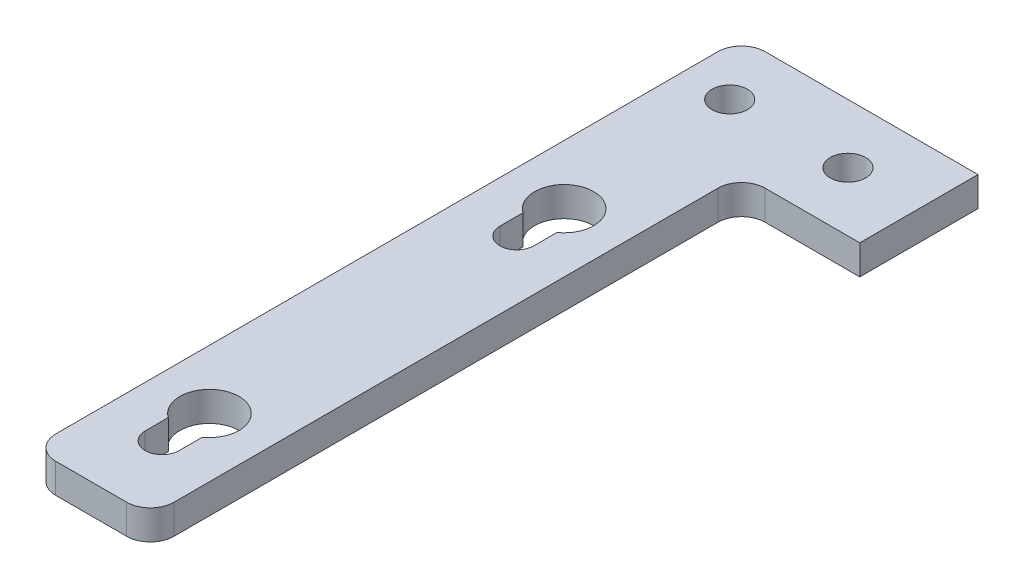
ISO-10303-21;
HEADER;
FILE_DESCRIPTION(('STEP AP214'),'2;1');
FILE_NAME('part.step','',(''),(''),'','','');
FILE_SCHEMA(('AUTOMOTIVE_DESIGN { 1 0 10303 214 1 1 1 1 }'));
ENDSEC;
DATA;
#1=APPLICATION_CONTEXT('core data for automotive mechanical design processes');
#2=APPLICATION_PROTOCOL_DEFINITION('international standard','automotive_design',2000,#1);
#3=PRODUCT_CONTEXT('',#1,'mechanical');
#4=PRODUCT('Part','Part','',(#3));
#5=PRODUCT_RELATED_PRODUCT_CATEGORY('part','',(#4));
#6=PRODUCT_DEFINITION_FORMATION('','',#4);
#7=PRODUCT_DEFINITION_CONTEXT('part definition',#1,'design');
#8=PRODUCT_DEFINITION('design','',#6,#7);
#9=PRODUCT_DEFINITION_SHAPE('','',#8);
#10=(LENGTH_UNIT() NAMED_UNIT(*) SI_UNIT(.MILLI.,.METRE.));
#11=(NAMED_UNIT(*) PLANE_ANGLE_UNIT() SI_UNIT($,.RADIAN.));
#12=(NAMED_UNIT(*) SI_UNIT($,.STERADIAN.) SOLID_ANGLE_UNIT());
#13=UNCERTAINTY_MEASURE_WITH_UNIT(LENGTH_MEASURE(1.E-05),#10,'distance_accuracy_value','');
#14=(GEOMETRIC_REPRESENTATION_CONTEXT(3) GLOBAL_UNCERTAINTY_ASSIGNED_CONTEXT((#13)) GLOBAL_UNIT_ASSIGNED_CONTEXT((#10,
#11,#12)) REPRESENTATION_CONTEXT('',''));
#15=CARTESIAN_POINT('',(0.,0.,0.));
#16=DIRECTION('',(0.,0.,1.));
#17=DIRECTION('',(1.,0.,0.));
#18=AXIS2_PLACEMENT_3D('',#15,#16,#17);
#19=CARTESIAN_POINT('',(0.,3.175,-76.2));
#20=DIRECTION('',(0.,0.,-1.));
#21=DIRECTION('',(-1.,0.,0.));
#22=AXIS2_PLACEMENT_3D('',#19,#20,#21);
#23=PLANE('',#22);
#24=DIRECTION('',(1.,0.,0.));
#25=VECTOR('',#24,1.);
#26=CARTESIAN_POINT('',(0.,0.,-76.2));
#27=LINE('',#26,#25);
#28=CARTESIAN_POINT('',(2.54,0.,-76.2));
#29=VERTEX_POINT('',#28);
#30=CARTESIAN_POINT('',(25.4,0.,-76.2));
#31=VERTEX_POINT('',#30);
#32=EDGE_CURVE('E256',#29,#31,#27,.T.);
#33=ORIENTED_EDGE('',*,*,#32,.F.);
#34=DIRECTION('',(0.,-1.,0.));
#35=VECTOR('',#34,1.);
#36=CARTESIAN_POINT('',(2.54,3.175,-76.2));
#37=LINE('',#36,#35);
#38=CARTESIAN_POINT('',(2.54,3.175,-76.2));
#39=VERTEX_POINT('',#38);
#40=EDGE_CURVE('E323',#29,#39,#37,.F.);
#41=ORIENTED_EDGE('',*,*,#40,.T.);
#42=DIRECTION('',(1.,0.,0.));
#43=VECTOR('',#42,1.);
#44=CARTESIAN_POINT('',(0.,3.175,-76.2));
#45=LINE('',#44,#43);
#46=CARTESIAN_POINT('',(25.4,3.175,-76.2));
#47=VERTEX_POINT('',#46);
#48=EDGE_CURVE('E259',#39,#47,#45,.T.);
#49=ORIENTED_EDGE('',*,*,#48,.T.);
#50=DIRECTION('',(0.,-1.,0.));
#51=VECTOR('',#50,1.);
#52=CARTESIAN_POINT('',(25.4,3.175,-76.2));
#53=LINE('',#52,#51);
#54=EDGE_CURVE('E275',#47,#31,#53,.T.);
#55=ORIENTED_EDGE('',*,*,#54,.T.);
#56=EDGE_LOOP('',(#33,#41,#49,#55));
#57=FACE_BOUND('',#56,.T.);
#58=ADVANCED_FACE('F50',(#57),#23,.T.);
#59=CARTESIAN_POINT('',(0.,3.175,0.));
#60=DIRECTION('',(-1.,0.,0.));
#61=DIRECTION('',(0.,0.,1.));
#62=AXIS2_PLACEMENT_3D('',#59,#60,#61);
#63=PLANE('',#62);
#64=DIRECTION('',(0.,0.,-1.));
#65=VECTOR('',#64,1.);
#66=CARTESIAN_POINT('',(0.,0.,0.));
#67=LINE('',#66,#65);
#68=CARTESIAN_POINT('',(0.,0.,-2.54));
#69=VERTEX_POINT('',#68);
#70=CARTESIAN_POINT('',(0.,0.,-73.66));
#71=VERTEX_POINT('',#70);
#72=EDGE_CURVE('E277',#69,#71,#67,.T.);
#73=ORIENTED_EDGE('',*,*,#72,.F.);
#74=DIRECTION('',(0.,-1.,0.));
#75=VECTOR('',#74,1.);
#76=CARTESIAN_POINT('',(0.,3.175,-2.54));
#77=LINE('',#76,#75);
#78=CARTESIAN_POINT('',(0.,3.175,-2.54));
#79=VERTEX_POINT('',#78);
#80=EDGE_CURVE('E72',#69,#79,#77,.F.);
#81=ORIENTED_EDGE('',*,*,#80,.T.);
#82=DIRECTION('',(0.,0.,-1.));
#83=VECTOR('',#82,1.);
#84=CARTESIAN_POINT('',(0.,3.175,0.));
#85=LINE('',#84,#83);
#86=CARTESIAN_POINT('',(0.,3.175,-73.66));
#87=VERTEX_POINT('',#86);
#88=EDGE_CURVE('E261',#79,#87,#85,.T.);
#89=ORIENTED_EDGE('',*,*,#88,.T.);
#90=DIRECTION('',(0.,-1.,0.));
#91=VECTOR('',#90,1.);
#92=CARTESIAN_POINT('',(0.,3.175,-73.66));
#93=LINE('',#92,#91);
#94=EDGE_CURVE('E319',#87,#71,#93,.T.);
#95=ORIENTED_EDGE('',*,*,#94,.T.);
#96=EDGE_LOOP('',(#73,#81,#89,#95));
#97=FACE_BOUND('',#96,.T.);
#98=ADVANCED_FACE('F350',(#97),#63,.T.);
#99=CARTESIAN_POINT('',(0.,3.175,0.));
#100=DIRECTION('',(0.,0.,-1.));
#101=DIRECTION('',(-1.,0.,0.));
#102=AXIS2_PLACEMENT_3D('',#99,#100,#101);
#103=PLANE('',#102);
#104=DIRECTION('',(1.,0.,0.));
#105=VECTOR('',#104,1.);
#106=CARTESIAN_POINT('',(0.,0.,0.));
#107=LINE('',#106,#105);
#108=CARTESIAN_POINT('',(2.54,0.,0.));
#109=VERTEX_POINT('',#108);
#110=CARTESIAN_POINT('',(10.16,0.,0.));
#111=VERTEX_POINT('',#110);
#112=EDGE_CURVE('E280',#109,#111,#107,.T.);
#113=ORIENTED_EDGE('',*,*,#112,.T.);
#114=DIRECTION('',(0.,-1.,0.));
#115=VECTOR('',#114,1.);
#116=CARTESIAN_POINT('',(10.16,3.175,0.));
#117=LINE('',#116,#115);
#118=CARTESIAN_POINT('',(10.16,3.175,0.));
#119=VERTEX_POINT('',#118);
#120=EDGE_CURVE('E312',#111,#119,#117,.F.);
#121=ORIENTED_EDGE('',*,*,#120,.T.);
#122=DIRECTION('',(1.,0.,0.));
#123=VECTOR('',#122,1.);
#124=CARTESIAN_POINT('',(0.,3.175,0.));
#125=LINE('',#124,#123);
#126=CARTESIAN_POINT('',(2.54,3.175,0.));
#127=VERTEX_POINT('',#126);
#128=EDGE_CURVE('E264',#127,#119,#125,.T.);
#129=ORIENTED_EDGE('',*,*,#128,.F.);
#130=DIRECTION('',(0.,-1.,0.));
#131=VECTOR('',#130,1.);
#132=CARTESIAN_POINT('',(2.54,0.,0.));
#133=LINE('',#132,#131);
#134=EDGE_CURVE('E309',#127,#109,#133,.T.);
#135=ORIENTED_EDGE('',*,*,#134,.T.);
#136=EDGE_LOOP('',(#113,#121,#129,#135));
#137=FACE_BOUND('',#136,.T.);
#138=ADVANCED_FACE('F359',(#137),#103,.F.);
#139=CARTESIAN_POINT('',(12.7,3.175,0.));
#140=DIRECTION('',(-1.,0.,0.));
#141=DIRECTION('',(0.,0.,1.));
#142=AXIS2_PLACEMENT_3D('',#139,#140,#141);
#143=PLANE('',#142);
#144=DIRECTION('',(0.,0.,-1.));
#145=VECTOR('',#144,1.);
#146=CARTESIAN_POINT('',(12.7,0.,0.));
#147=LINE('',#146,#145);
#148=CARTESIAN_POINT('',(12.7,0.,-2.54));
#149=VERTEX_POINT('',#148);
#150=CARTESIAN_POINT('',(12.7,0.,-60.96));
#151=VERTEX_POINT('',#150);
#152=EDGE_CURVE('E283',#149,#151,#147,.T.);
#153=ORIENTED_EDGE('',*,*,#152,.T.);
#154=DIRECTION('',(0.,-1.,0.));
#155=VECTOR('',#154,1.);
#156=CARTESIAN_POINT('',(12.7,3.175,-60.96));
#157=LINE('',#156,#155);
#158=CARTESIAN_POINT('',(12.7,3.175,-60.96));
#159=VERTEX_POINT('',#158);
#160=EDGE_CURVE('E301',#151,#159,#157,.F.);
#161=ORIENTED_EDGE('',*,*,#160,.T.);
#162=DIRECTION('',(0.,0.,-1.));
#163=VECTOR('',#162,1.);
#164=CARTESIAN_POINT('',(12.7,3.175,0.));
#165=LINE('',#164,#163);
#166=CARTESIAN_POINT('',(12.7,3.175,-2.54));
#167=VERTEX_POINT('',#166);
#168=EDGE_CURVE('E267',#167,#159,#165,.T.);
#169=ORIENTED_EDGE('',*,*,#168,.F.);
#170=DIRECTION('',(0.,-1.,0.));
#171=VECTOR('',#170,1.);
#172=CARTESIAN_POINT('',(12.7,3.175,-2.54));
#173=LINE('',#172,#171);
#174=EDGE_CURVE('E298',#167,#149,#173,.T.);
#175=ORIENTED_EDGE('',*,*,#174,.T.);
#176=EDGE_LOOP('',(#153,#161,#169,#175));
#177=FACE_BOUND('',#176,.T.);
#178=ADVANCED_FACE('F332',(#177),#143,.F.);
#179=CARTESIAN_POINT('',(0.,3.175,-63.5));
#180=DIRECTION('',(0.,0.,-1.));
#181=DIRECTION('',(-1.,0.,0.));
#182=AXIS2_PLACEMENT_3D('',#179,#180,#181);
#183=PLANE('',#182);
#184=DIRECTION('',(1.,0.,0.));
#185=VECTOR('',#184,1.);
#186=CARTESIAN_POINT('',(0.,3.175,-63.5));
#187=LINE('',#186,#185);
#188=CARTESIAN_POINT('',(15.24,3.175,-63.5));
#189=VERTEX_POINT('',#188);
#190=CARTESIAN_POINT('',(25.4,3.175,-63.5));
#191=VERTEX_POINT('',#190);
#192=EDGE_CURVE('E270',#189,#191,#187,.T.);
#193=ORIENTED_EDGE('',*,*,#192,.F.);
#194=DIRECTION('',(0.,-1.,0.));
#195=VECTOR('',#194,1.);
#196=CARTESIAN_POINT('',(15.24,0.,-63.5));
#197=LINE('',#196,#195);
#198=CARTESIAN_POINT('',(15.24,0.,-63.5));
#199=VERTEX_POINT('',#198);
#200=EDGE_CURVE('E295',#189,#199,#197,.T.);
#201=ORIENTED_EDGE('',*,*,#200,.T.);
#202=DIRECTION('',(1.,0.,0.));
#203=VECTOR('',#202,1.);
#204=CARTESIAN_POINT('',(0.,0.,-63.5));
#205=LINE('',#204,#203);
#206=CARTESIAN_POINT('',(25.4,0.,-63.5));
#207=VERTEX_POINT('',#206);
#208=EDGE_CURVE('E286',#199,#207,#205,.T.);
#209=ORIENTED_EDGE('',*,*,#208,.T.);
#210=DIRECTION('',(0.,-1.,0.));
#211=VECTOR('',#210,1.);
#212=CARTESIAN_POINT('',(25.4,3.175,-63.5));
#213=LINE('',#212,#211);
#214=EDGE_CURVE('E292',#191,#207,#213,.T.);
#215=ORIENTED_EDGE('',*,*,#214,.F.);
#216=EDGE_LOOP('',(#193,#201,#209,#215));
#217=FACE_BOUND('',#216,.T.);
#218=ADVANCED_FACE('F341',(#217),#183,.F.);
#219=CARTESIAN_POINT('',(25.4,3.175,0.));
#220=DIRECTION('',(1.,0.,0.));
#221=DIRECTION('',(0.,0.,-1.));
#222=AXIS2_PLACEMENT_3D('',#219,#220,#221);
#223=PLANE('',#222);
#224=DIRECTION('',(0.,0.,1.));
#225=VECTOR('',#224,1.);
#226=CARTESIAN_POINT('',(25.4,0.,0.));
#227=LINE('',#226,#225);
#228=EDGE_CURVE('E262',#31,#207,#227,.T.);
#229=ORIENTED_EDGE('',*,*,#228,.F.);
#230=ORIENTED_EDGE('',*,*,#54,.F.);
#231=DIRECTION('',(0.,0.,1.));
#232=VECTOR('',#231,1.);
#233=CARTESIAN_POINT('',(25.4,3.175,0.));
#234=LINE('',#233,#232);
#235=EDGE_CURVE('E272',#47,#191,#234,.T.);
#236=ORIENTED_EDGE('',*,*,#235,.T.);
#237=ORIENTED_EDGE('',*,*,#214,.T.);
#238=EDGE_LOOP('',(#229,#230,#236,#237));
#239=FACE_BOUND('',#238,.T.);
#240=ADVANCED_FACE('F345',(#239),#223,.T.);
#241=CARTESIAN_POINT('',(0.,3.175,0.));
#242=DIRECTION('',(0.,1.,0.));
#243=DIRECTION('',(0.,0.,1.));
#244=AXIS2_PLACEMENT_3D('',#241,#242,#243);
#245=PLANE('',#244);
#246=CARTESIAN_POINT('',(6.34999999999999,3.175,-50.8));
#247=DIRECTION('',(0.,1.,0.));
#248=DIRECTION('',(0.,0.,1.));
#249=AXIS2_PLACEMENT_3D('',#246,#247,#248);
#250=CIRCLE('',#249,3.175);
#251=CARTESIAN_POINT('',(8.1788,3.175,-48.2045972258626));
#252=VERTEX_POINT('',#251);
#253=CARTESIAN_POINT('',(4.5212,3.175,-48.2045972258626));
#254=VERTEX_POINT('',#253);
#255=EDGE_CURVE('E201',#252,#254,#250,.T.);
#256=ORIENTED_EDGE('',*,*,#255,.F.);
#257=DIRECTION('',(0.,0.,-1.));
#258=VECTOR('',#257,1.);
#259=CARTESIAN_POINT('',(8.17880000000003,3.175,0.));
#260=LINE('',#259,#258);
#261=CARTESIAN_POINT('',(8.1788,3.175,-45.72));
#262=VERTEX_POINT('',#261);
#263=EDGE_CURVE('E180',#262,#252,#260,.T.);
#264=ORIENTED_EDGE('',*,*,#263,.F.);
#265=CARTESIAN_POINT('',(6.34999999999999,3.175,-45.72));
#266=DIRECTION('',(0.,1.,0.));
#267=DIRECTION('',(0.,0.,1.));
#268=AXIS2_PLACEMENT_3D('',#265,#266,#267);
#269=CIRCLE('',#268,1.8288);
#270=CARTESIAN_POINT('',(4.52119999999999,3.175,-45.72));
#271=VERTEX_POINT('',#270);
#272=EDGE_CURVE('E191',#271,#262,#269,.T.);
#273=ORIENTED_EDGE('',*,*,#272,.F.);
#274=DIRECTION('',(0.,0.,-1.));
#275=VECTOR('',#274,1.);
#276=CARTESIAN_POINT('',(4.52119999999998,3.175,0.));
#277=LINE('',#276,#275);
#278=EDGE_CURVE('E204',#271,#254,#277,.T.);
#279=ORIENTED_EDGE('',*,*,#278,.T.);
#280=EDGE_LOOP('',(#256,#264,#273,#279));
#281=FACE_BOUND('',#280,.T.);
#282=DIRECTION('',(0.,0.,-1.));
#283=VECTOR('',#282,1.);
#284=CARTESIAN_POINT('',(8.1788,3.175,0.));
#285=LINE('',#284,#283);
#286=CARTESIAN_POINT('',(8.1788,3.175,-7.62));
#287=VERTEX_POINT('',#286);
#288=CARTESIAN_POINT('',(8.1788,3.175,-10.1045972258626));
#289=VERTEX_POINT('',#288);
#290=EDGE_CURVE('E234',#287,#289,#285,.T.);
#291=ORIENTED_EDGE('',*,*,#290,.F.);
#292=CARTESIAN_POINT('',(6.35,3.175,-7.62));
#293=DIRECTION('',(0.,1.,0.));
#294=DIRECTION('',(0.,0.,1.));
#295=AXIS2_PLACEMENT_3D('',#292,#293,#294);
#296=CIRCLE('',#295,1.8288);
#297=CARTESIAN_POINT('',(4.5212,3.175,-7.62));
#298=VERTEX_POINT('',#297);
#299=EDGE_CURVE('E224',#298,#287,#296,.T.);
#300=ORIENTED_EDGE('',*,*,#299,.F.);
#301=DIRECTION('',(0.,0.,-1.));
#302=VECTOR('',#301,1.);
#303=CARTESIAN_POINT('',(4.52119999999999,3.175,0.));
#304=LINE('',#303,#302);
#305=CARTESIAN_POINT('',(4.52119999999999,3.175,-10.1045972258626));
#306=VERTEX_POINT('',#305);
#307=EDGE_CURVE('E227',#298,#306,#304,.T.);
#308=ORIENTED_EDGE('',*,*,#307,.T.);
#309=CARTESIAN_POINT('',(6.35,3.175,-12.7));
#310=DIRECTION('',(0.,1.,0.));
#311=DIRECTION('',(0.,0.,1.));
#312=AXIS2_PLACEMENT_3D('',#309,#310,#311);
#313=CIRCLE('',#312,3.175);
#314=EDGE_CURVE('E231',#289,#306,#313,.T.);
#315=ORIENTED_EDGE('',*,*,#314,.F.);
#316=EDGE_LOOP('',(#291,#300,#308,#315));
#317=FACE_BOUND('',#316,.T.);
#318=CARTESIAN_POINT('',(17.78,3.175,-69.85));
#319=DIRECTION('',(0.,1.,0.));
#320=DIRECTION('',(0.,0.,1.));
#321=AXIS2_PLACEMENT_3D('',#318,#319,#320);
#322=CIRCLE('',#321,1.905);
#323=CARTESIAN_POINT('',(17.78,3.175,-67.945));
#324=VERTEX_POINT('',#323);
#325=EDGE_CURVE('E247',#324,#324,#322,.T.);
#326=ORIENTED_EDGE('',*,*,#325,.F.);
#327=EDGE_LOOP('',(#326));
#328=FACE_BOUND('',#327,.T.);
#329=CARTESIAN_POINT('',(5.08,3.175,-69.85));
#330=DIRECTION('',(0.,1.,0.));
#331=DIRECTION('',(0.,0.,1.));
#332=AXIS2_PLACEMENT_3D('',#329,#330,#331);
#333=CIRCLE('',#332,1.905);
#334=CARTESIAN_POINT('',(5.08,3.175,-67.945));
#335=VERTEX_POINT('',#334);
#336=EDGE_CURVE('E250',#335,#335,#333,.T.);
#337=ORIENTED_EDGE('',*,*,#336,.F.);
#338=EDGE_LOOP('',(#337));
#339=FACE_BOUND('',#338,.T.);
#340=ORIENTED_EDGE('',*,*,#128,.T.);
#341=CARTESIAN_POINT('',(10.16,3.175,-2.54));
#342=DIRECTION('',(0.,1.,0.));
#343=DIRECTION('',(0.,0.,1.));
#344=AXIS2_PLACEMENT_3D('',#341,#342,#343);
#345=CIRCLE('',#344,2.54);
#346=EDGE_CURVE('E317',#119,#167,#345,.T.);
#347=ORIENTED_EDGE('',*,*,#346,.T.);
#348=ORIENTED_EDGE('',*,*,#168,.T.);
#349=CARTESIAN_POINT('',(15.24,3.175,-60.96));
#350=DIRECTION('',(0.,1.,0.));
#351=DIRECTION('',(0.,0.,1.));
#352=AXIS2_PLACEMENT_3D('',#349,#350,#351);
#353=CIRCLE('',#352,2.54);
#354=EDGE_CURVE('E12',#159,#189,#353,.F.);
#355=ORIENTED_EDGE('',*,*,#354,.T.);
#356=ORIENTED_EDGE('',*,*,#192,.T.);
#357=ORIENTED_EDGE('',*,*,#235,.F.);
#358=ORIENTED_EDGE('',*,*,#48,.F.);
#359=CARTESIAN_POINT('',(2.54,3.175,-73.66));
#360=DIRECTION('',(0.,1.,0.));
#361=DIRECTION('',(0.,0.,1.));
#362=AXIS2_PLACEMENT_3D('',#359,#360,#361);
#363=CIRCLE('',#362,2.54);
#364=EDGE_CURVE('E65',#39,#87,#363,.T.);
#365=ORIENTED_EDGE('',*,*,#364,.T.);
#366=ORIENTED_EDGE('',*,*,#88,.F.);
#367=CARTESIAN_POINT('',(2.54,3.175,-2.54));
#368=DIRECTION('',(0.,1.,0.));
#369=DIRECTION('',(0.,0.,1.));
#370=AXIS2_PLACEMENT_3D('',#367,#368,#369);
#371=CIRCLE('',#370,2.54);
#372=EDGE_CURVE('E315',#79,#127,#371,.T.);
#373=ORIENTED_EDGE('',*,*,#372,.T.);
#374=EDGE_LOOP('',(#340,#347,#348,#355,#356,#357,#358,#365,#366,#373));
#375=FACE_BOUND('',#374,.T.);
#376=ADVANCED_FACE('F198',(#281,#317,#328,#339,#375),#245,.T.);
#377=CARTESIAN_POINT('',(0.,0.,0.));
#378=DIRECTION('',(0.,1.,0.));
#379=DIRECTION('',(0.,0.,1.));
#380=AXIS2_PLACEMENT_3D('',#377,#378,#379);
#381=PLANE('',#380);
#382=DIRECTION('',(0.,0.,-1.));
#383=VECTOR('',#382,1.);
#384=CARTESIAN_POINT('',(8.17880000000003,0.,0.));
#385=LINE('',#384,#383);
#386=CARTESIAN_POINT('',(8.1788,0.,-45.72));
#387=VERTEX_POINT('',#386);
#388=CARTESIAN_POINT('',(8.1788,0.,-48.2045972258626));
#389=VERTEX_POINT('',#388);
#390=EDGE_CURVE('E183',#387,#389,#385,.T.);
#391=ORIENTED_EDGE('',*,*,#390,.T.);
#392=CARTESIAN_POINT('',(6.34999999999999,0.,-50.8));
#393=DIRECTION('',(0.,1.,0.));
#394=DIRECTION('',(0.,0.,1.));
#395=AXIS2_PLACEMENT_3D('',#392,#393,#394);
#396=CIRCLE('',#395,3.175);
#397=CARTESIAN_POINT('',(4.5212,0.,-48.2045972258626));
#398=VERTEX_POINT('',#397);
#399=EDGE_CURVE('E210',#389,#398,#396,.T.);
#400=ORIENTED_EDGE('',*,*,#399,.T.);
#401=DIRECTION('',(0.,0.,-1.));
#402=VECTOR('',#401,1.);
#403=CARTESIAN_POINT('',(4.52119999999998,0.,0.));
#404=LINE('',#403,#402);
#405=CARTESIAN_POINT('',(4.52119999999999,0.,-45.72));
#406=VERTEX_POINT('',#405);
#407=EDGE_CURVE('E208',#406,#398,#404,.T.);
#408=ORIENTED_EDGE('',*,*,#407,.F.);
#409=CARTESIAN_POINT('',(6.34999999999999,0.,-45.72));
#410=DIRECTION('',(0.,1.,0.));
#411=DIRECTION('',(0.,0.,1.));
#412=AXIS2_PLACEMENT_3D('',#409,#410,#411);
#413=CIRCLE('',#412,1.8288);
#414=EDGE_CURVE('E196',#406,#387,#413,.T.);
#415=ORIENTED_EDGE('',*,*,#414,.T.);
#416=EDGE_LOOP('',(#391,#400,#408,#415));
#417=FACE_BOUND('',#416,.T.);
#418=CARTESIAN_POINT('',(6.35,0.,-7.62));
#419=DIRECTION('',(0.,1.,0.));
#420=DIRECTION('',(0.,0.,1.));
#421=AXIS2_PLACEMENT_3D('',#418,#419,#420);
#422=CIRCLE('',#421,1.8288);
#423=CARTESIAN_POINT('',(4.5212,0.,-7.62));
#424=VERTEX_POINT('',#423);
#425=CARTESIAN_POINT('',(8.1788,0.,-7.62));
#426=VERTEX_POINT('',#425);
#427=EDGE_CURVE('E218',#424,#426,#422,.T.);
#428=ORIENTED_EDGE('',*,*,#427,.T.);
#429=DIRECTION('',(0.,0.,-1.));
#430=VECTOR('',#429,1.);
#431=CARTESIAN_POINT('',(8.1788,0.,0.));
#432=LINE('',#431,#430);
#433=CARTESIAN_POINT('',(8.1788,0.,-10.1045972258626));
#434=VERTEX_POINT('',#433);
#435=EDGE_CURVE('E228',#426,#434,#432,.T.);
#436=ORIENTED_EDGE('',*,*,#435,.T.);
#437=CARTESIAN_POINT('',(6.35,0.,-12.7));
#438=DIRECTION('',(0.,1.,0.));
#439=DIRECTION('',(0.,0.,1.));
#440=AXIS2_PLACEMENT_3D('',#437,#438,#439);
#441=CIRCLE('',#440,3.175);
#442=CARTESIAN_POINT('',(4.52119999999999,0.,-10.1045972258626));
#443=VERTEX_POINT('',#442);
#444=EDGE_CURVE('E242',#434,#443,#441,.T.);
#445=ORIENTED_EDGE('',*,*,#444,.T.);
#446=DIRECTION('',(0.,0.,-1.));
#447=VECTOR('',#446,1.);
#448=CARTESIAN_POINT('',(4.52119999999999,0.,0.));
#449=LINE('',#448,#447);
#450=EDGE_CURVE('E239',#424,#443,#449,.T.);
#451=ORIENTED_EDGE('',*,*,#450,.F.);
#452=EDGE_LOOP('',(#428,#436,#445,#451));
#453=FACE_BOUND('',#452,.T.);
#454=CARTESIAN_POINT('',(17.78,0.,-69.85));
#455=DIRECTION('',(0.,1.,0.));
#456=DIRECTION('',(0.,0.,1.));
#457=AXIS2_PLACEMENT_3D('',#454,#455,#456);
#458=CIRCLE('',#457,1.905);
#459=CARTESIAN_POINT('',(17.78,0.,-67.945));
#460=VERTEX_POINT('',#459);
#461=EDGE_CURVE('E236',#460,#460,#458,.T.);
#462=ORIENTED_EDGE('',*,*,#461,.T.);
#463=EDGE_LOOP('',(#462));
#464=FACE_BOUND('',#463,.T.);
#465=CARTESIAN_POINT('',(5.08,0.,-69.85));
#466=DIRECTION('',(0.,1.,0.));
#467=DIRECTION('',(0.,0.,1.));
#468=AXIS2_PLACEMENT_3D('',#465,#466,#467);
#469=CIRCLE('',#468,1.905);
#470=CARTESIAN_POINT('',(5.08,0.,-67.945));
#471=VERTEX_POINT('',#470);
#472=EDGE_CURVE('E253',#471,#471,#469,.T.);
#473=ORIENTED_EDGE('',*,*,#472,.T.);
#474=EDGE_LOOP('',(#473));
#475=FACE_BOUND('',#474,.T.);
#476=ORIENTED_EDGE('',*,*,#152,.F.);
#477=CARTESIAN_POINT('',(10.16,0.,-2.54));
#478=DIRECTION('',(0.,1.,0.));
#479=DIRECTION('',(0.,0.,1.));
#480=AXIS2_PLACEMENT_3D('',#477,#478,#479);
#481=CIRCLE('',#480,2.54);
#482=EDGE_CURVE('E307',#149,#111,#481,.F.);
#483=ORIENTED_EDGE('',*,*,#482,.T.);
#484=ORIENTED_EDGE('',*,*,#112,.F.);
#485=CARTESIAN_POINT('',(2.54,0.,-2.54));
#486=DIRECTION('',(0.,1.,0.));
#487=DIRECTION('',(0.,0.,1.));
#488=AXIS2_PLACEMENT_3D('',#485,#486,#487);
#489=CIRCLE('',#488,2.54);
#490=EDGE_CURVE('E305',#109,#69,#489,.F.);
#491=ORIENTED_EDGE('',*,*,#490,.T.);
#492=ORIENTED_EDGE('',*,*,#72,.T.);
#493=CARTESIAN_POINT('',(2.54,0.,-73.66));
#494=DIRECTION('',(0.,1.,0.));
#495=DIRECTION('',(0.,0.,1.));
#496=AXIS2_PLACEMENT_3D('',#493,#494,#495);
#497=CIRCLE('',#496,2.54);
#498=EDGE_CURVE('E303',#71,#29,#497,.F.);
#499=ORIENTED_EDGE('',*,*,#498,.T.);
#500=ORIENTED_EDGE('',*,*,#32,.T.);
#501=ORIENTED_EDGE('',*,*,#228,.T.);
#502=ORIENTED_EDGE('',*,*,#208,.F.);
#503=CARTESIAN_POINT('',(15.24,0.,-60.96));
#504=DIRECTION('',(0.,1.,0.));
#505=DIRECTION('',(0.,0.,1.));
#506=AXIS2_PLACEMENT_3D('',#503,#504,#505);
#507=CIRCLE('',#506,2.54);
#508=EDGE_CURVE('E58',#199,#151,#507,.T.);
#509=ORIENTED_EDGE('',*,*,#508,.T.);
#510=EDGE_LOOP('',(#476,#483,#484,#491,#492,#499,#500,#501,#502,#509));
#511=FACE_BOUND('',#510,.T.);
#512=ADVANCED_FACE('F327',(#417,#453,#464,#475,#511),#381,.F.);
#513=CARTESIAN_POINT('',(5.08,0.,-69.85));
#514=DIRECTION('',(0.,1.,0.));
#515=DIRECTION('',(0.,0.,1.));
#516=AXIS2_PLACEMENT_3D('',#513,#514,#515);
#517=CYLINDRICAL_SURFACE('',#516,1.905);
#518=ORIENTED_EDGE('',*,*,#472,.F.);
#519=EDGE_LOOP('',(#518));
#520=FACE_BOUND('',#519,.T.);
#521=ORIENTED_EDGE('',*,*,#336,.T.);
#522=EDGE_LOOP('',(#521));
#523=FACE_BOUND('',#522,.T.);
#524=ADVANCED_FACE('F389',(#520,#523),#517,.F.);
#525=CARTESIAN_POINT('',(17.78,0.,-69.85));
#526=DIRECTION('',(0.,1.,0.));
#527=DIRECTION('',(0.,0.,1.));
#528=AXIS2_PLACEMENT_3D('',#525,#526,#527);
#529=CYLINDRICAL_SURFACE('',#528,1.905);
#530=ORIENTED_EDGE('',*,*,#461,.F.);
#531=EDGE_LOOP('',(#530));
#532=FACE_BOUND('',#531,.T.);
#533=ORIENTED_EDGE('',*,*,#325,.T.);
#534=EDGE_LOOP('',(#533));
#535=FACE_BOUND('',#534,.T.);
#536=ADVANCED_FACE('F395',(#532,#535),#529,.F.);
#537=CARTESIAN_POINT('',(8.1788,0.,0.));
#538=DIRECTION('',(1.,0.,0.));
#539=DIRECTION('',(0.,0.,-1.));
#540=AXIS2_PLACEMENT_3D('',#537,#538,#539);
#541=PLANE('',#540);
#542=ORIENTED_EDGE('',*,*,#290,.T.);
#543=DIRECTION('',(0.,1.,0.));
#544=VECTOR('',#543,1.);
#545=CARTESIAN_POINT('',(8.1788,0.,-10.1045972258626));
#546=LINE('',#545,#544);
#547=EDGE_CURVE('E215',#434,#289,#546,.T.);
#548=ORIENTED_EDGE('',*,*,#547,.F.);
#549=ORIENTED_EDGE('',*,*,#435,.F.);
#550=DIRECTION('',(0.,1.,0.));
#551=VECTOR('',#550,1.);
#552=CARTESIAN_POINT('',(8.1788,0.,-7.62));
#553=LINE('',#552,#551);
#554=EDGE_CURVE('E195',#426,#287,#553,.T.);
#555=ORIENTED_EDGE('',*,*,#554,.T.);
#556=EDGE_LOOP('',(#542,#548,#549,#555));
#557=FACE_BOUND('',#556,.T.);
#558=ADVANCED_FACE('F399',(#557),#541,.F.);
#559=CARTESIAN_POINT('',(6.35,0.,-7.62));
#560=DIRECTION('',(0.,1.,0.));
#561=DIRECTION('',(0.,0.,1.));
#562=AXIS2_PLACEMENT_3D('',#559,#560,#561);
#563=CYLINDRICAL_SURFACE('',#562,1.8288);
#564=ORIENTED_EDGE('',*,*,#299,.T.);
#565=ORIENTED_EDGE('',*,*,#554,.F.);
#566=ORIENTED_EDGE('',*,*,#427,.F.);
#567=DIRECTION('',(0.,1.,0.));
#568=VECTOR('',#567,1.);
#569=CARTESIAN_POINT('',(4.5212,0.,-7.62));
#570=LINE('',#569,#568);
#571=EDGE_CURVE('E221',#424,#298,#570,.T.);
#572=ORIENTED_EDGE('',*,*,#571,.T.);
#573=EDGE_LOOP('',(#564,#565,#566,#572));
#574=FACE_BOUND('',#573,.T.);
#575=ADVANCED_FACE('F401',(#574),#563,.F.);
#576=CARTESIAN_POINT('',(4.52119999999999,0.,0.));
#577=DIRECTION('',(1.,0.,0.));
#578=DIRECTION('',(0.,0.,-1.));
#579=AXIS2_PLACEMENT_3D('',#576,#577,#578);
#580=PLANE('',#579);
#581=ORIENTED_EDGE('',*,*,#307,.F.);
#582=ORIENTED_EDGE('',*,*,#571,.F.);
#583=ORIENTED_EDGE('',*,*,#450,.T.);
#584=DIRECTION('',(0.,1.,0.));
#585=VECTOR('',#584,1.);
#586=CARTESIAN_POINT('',(4.52119999999999,0.,-10.1045972258626));
#587=LINE('',#586,#585);
#588=EDGE_CURVE('E219',#443,#306,#587,.T.);
#589=ORIENTED_EDGE('',*,*,#588,.T.);
#590=EDGE_LOOP('',(#581,#582,#583,#589));
#591=FACE_BOUND('',#590,.T.);
#592=ADVANCED_FACE('F404',(#591),#580,.T.);
#593=CARTESIAN_POINT('',(6.35,0.,-12.7));
#594=DIRECTION('',(0.,1.,0.));
#595=DIRECTION('',(0.,0.,1.));
#596=AXIS2_PLACEMENT_3D('',#593,#594,#595);
#597=CYLINDRICAL_SURFACE('',#596,3.175);
#598=ORIENTED_EDGE('',*,*,#314,.T.);
#599=ORIENTED_EDGE('',*,*,#588,.F.);
#600=ORIENTED_EDGE('',*,*,#444,.F.);
#601=ORIENTED_EDGE('',*,*,#547,.T.);
#602=EDGE_LOOP('',(#598,#599,#600,#601));
#603=FACE_BOUND('',#602,.T.);
#604=ADVANCED_FACE('F408',(#603),#597,.F.);
#605=CARTESIAN_POINT('',(8.17880000000003,0.,0.));
#606=DIRECTION('',(1.,0.,0.));
#607=DIRECTION('',(0.,0.,-1.));
#608=AXIS2_PLACEMENT_3D('',#605,#606,#607);
#609=PLANE('',#608);
#610=ORIENTED_EDGE('',*,*,#263,.T.);
#611=DIRECTION('',(0.,1.,0.));
#612=VECTOR('',#611,1.);
#613=CARTESIAN_POINT('',(8.1788,0.,-48.2045972258626));
#614=LINE('',#613,#612);
#615=EDGE_CURVE('E211',#389,#252,#614,.T.);
#616=ORIENTED_EDGE('',*,*,#615,.F.);
#617=ORIENTED_EDGE('',*,*,#390,.F.);
#618=DIRECTION('',(0.,1.,0.));
#619=VECTOR('',#618,1.);
#620=CARTESIAN_POINT('',(8.1788,0.,-45.72));
#621=LINE('',#620,#619);
#622=EDGE_CURVE('E176',#387,#262,#621,.T.);
#623=ORIENTED_EDGE('',*,*,#622,.T.);
#624=EDGE_LOOP('',(#610,#616,#617,#623));
#625=FACE_BOUND('',#624,.T.);
#626=ADVANCED_FACE('F178',(#625),#609,.F.);
#627=CARTESIAN_POINT('',(4.52119999999998,0.,0.));
#628=DIRECTION('',(1.,0.,0.));
#629=DIRECTION('',(0.,0.,-1.));
#630=AXIS2_PLACEMENT_3D('',#627,#628,#629);
#631=PLANE('',#630);
#632=ORIENTED_EDGE('',*,*,#278,.F.);
#633=DIRECTION('',(0.,1.,0.));
#634=VECTOR('',#633,1.);
#635=CARTESIAN_POINT('',(4.52119999999999,0.,-45.72));
#636=LINE('',#635,#634);
#637=EDGE_CURVE('E187',#406,#271,#636,.T.);
#638=ORIENTED_EDGE('',*,*,#637,.F.);
#639=ORIENTED_EDGE('',*,*,#407,.T.);
#640=DIRECTION('',(0.,1.,0.));
#641=VECTOR('',#640,1.);
#642=CARTESIAN_POINT('',(4.5212,0.,-48.2045972258626));
#643=LINE('',#642,#641);
#644=EDGE_CURVE('E578',#398,#254,#643,.T.);
#645=ORIENTED_EDGE('',*,*,#644,.T.);
#646=EDGE_LOOP('',(#632,#638,#639,#645));
#647=FACE_BOUND('',#646,.T.);
#648=ADVANCED_FACE('F416',(#647),#631,.T.);
#649=CARTESIAN_POINT('',(6.34999999999999,0.,-50.8));
#650=DIRECTION('',(0.,1.,0.));
#651=DIRECTION('',(0.,0.,1.));
#652=AXIS2_PLACEMENT_3D('',#649,#650,#651);
#653=CYLINDRICAL_SURFACE('',#652,3.175);
#654=ORIENTED_EDGE('',*,*,#255,.T.);
#655=ORIENTED_EDGE('',*,*,#644,.F.);
#656=ORIENTED_EDGE('',*,*,#399,.F.);
#657=ORIENTED_EDGE('',*,*,#615,.T.);
#658=EDGE_LOOP('',(#654,#655,#656,#657));
#659=FACE_BOUND('',#658,.T.);
#660=ADVANCED_FACE('F371',(#659),#653,.F.);
#661=CARTESIAN_POINT('',(6.34999999999999,0.,-45.72));
#662=DIRECTION('',(0.,1.,0.));
#663=DIRECTION('',(0.,0.,1.));
#664=AXIS2_PLACEMENT_3D('',#661,#662,#663);
#665=CYLINDRICAL_SURFACE('',#664,1.8288);
#666=ORIENTED_EDGE('',*,*,#414,.F.);
#667=ORIENTED_EDGE('',*,*,#637,.T.);
#668=ORIENTED_EDGE('',*,*,#272,.T.);
#669=ORIENTED_EDGE('',*,*,#622,.F.);
#670=EDGE_LOOP('',(#666,#667,#668,#669));
#671=FACE_BOUND('',#670,.T.);
#672=ADVANCED_FACE('F192',(#671),#665,.F.);
#673=CARTESIAN_POINT('',(15.24,3.175,-60.96));
#674=DIRECTION('',(0.,1.,0.));
#675=DIRECTION('',(0.,0.,1.));
#676=AXIS2_PLACEMENT_3D('',#673,#674,#675);
#677=CYLINDRICAL_SURFACE('',#676,2.54);
#678=ORIENTED_EDGE('',*,*,#354,.F.);
#679=ORIENTED_EDGE('',*,*,#160,.F.);
#680=ORIENTED_EDGE('',*,*,#508,.F.);
#681=ORIENTED_EDGE('',*,*,#200,.F.);
#682=EDGE_LOOP('',(#678,#679,#680,#681));
#683=FACE_BOUND('',#682,.T.);
#684=ADVANCED_FACE('F336',(#683),#677,.F.);
#685=CARTESIAN_POINT('',(10.16,3.175,-2.54));
#686=DIRECTION('',(0.,-1.,0.));
#687=DIRECTION('',(0.,0.,-1.));
#688=AXIS2_PLACEMENT_3D('',#685,#686,#687);
#689=CYLINDRICAL_SURFACE('',#688,2.54);
#690=ORIENTED_EDGE('',*,*,#346,.F.);
#691=ORIENTED_EDGE('',*,*,#120,.F.);
#692=ORIENTED_EDGE('',*,*,#482,.F.);
#693=ORIENTED_EDGE('',*,*,#174,.F.);
#694=EDGE_LOOP('',(#690,#691,#692,#693));
#695=FACE_BOUND('',#694,.T.);
#696=ADVANCED_FACE('F363',(#695),#689,.T.);
#697=CARTESIAN_POINT('',(2.54,3.175,-2.54));
#698=DIRECTION('',(0.,1.,0.));
#699=DIRECTION('',(0.,0.,1.));
#700=AXIS2_PLACEMENT_3D('',#697,#698,#699);
#701=CYLINDRICAL_SURFACE('',#700,2.54);
#702=ORIENTED_EDGE('',*,*,#372,.F.);
#703=ORIENTED_EDGE('',*,*,#80,.F.);
#704=ORIENTED_EDGE('',*,*,#490,.F.);
#705=ORIENTED_EDGE('',*,*,#134,.F.);
#706=EDGE_LOOP('',(#702,#703,#704,#705));
#707=FACE_BOUND('',#706,.T.);
#708=ADVANCED_FACE('F356',(#707),#701,.T.);
#709=CARTESIAN_POINT('',(2.54,3.175,-73.66));
#710=DIRECTION('',(0.,-1.,0.));
#711=DIRECTION('',(0.,0.,-1.));
#712=AXIS2_PLACEMENT_3D('',#709,#710,#711);
#713=CYLINDRICAL_SURFACE('',#712,2.54);
#714=ORIENTED_EDGE('',*,*,#364,.F.);
#715=ORIENTED_EDGE('',*,*,#40,.F.);
#716=ORIENTED_EDGE('',*,*,#498,.F.);
#717=ORIENTED_EDGE('',*,*,#94,.F.);
#718=EDGE_LOOP('',(#714,#715,#716,#717));
#719=FACE_BOUND('',#718,.T.);
#720=ADVANCED_FACE('F52',(#719),#713,.T.);
#721=CLOSED_SHELL('',(#58,#98,#138,#178,#218,#240,#376,#512,#524,#536,#558,#575,#592,#604,#626,
#648,#660,#672,#684,#696,#708,#720));
#722=MANIFOLD_SOLID_BREP('B2',#721);
#723=ADVANCED_BREP_SHAPE_REPRESENTATION('',(#18,#722),#14);
#724=SHAPE_DEFINITION_REPRESENTATION(#9,#723);
ENDSEC;
END-ISO-10303-21;
